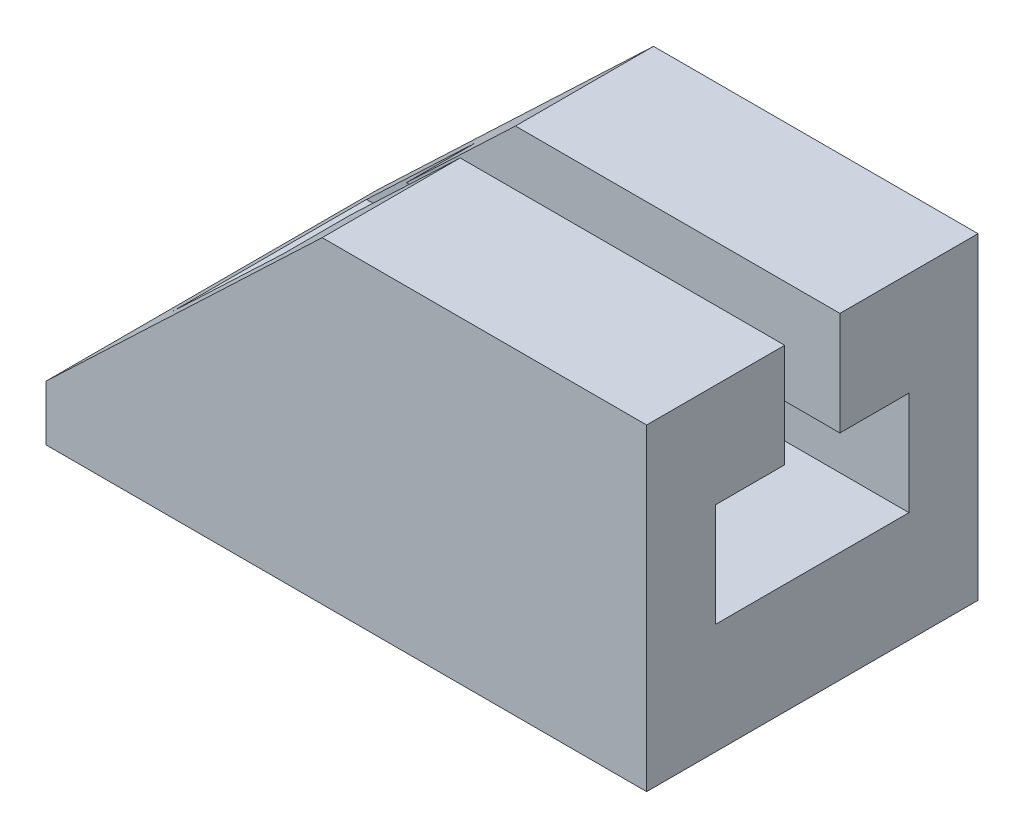
ISO-10303-21;
HEADER;
FILE_DESCRIPTION(('STEP AP214'),'2;1');
FILE_NAME('part.step','',(''),(''),'','','');
FILE_SCHEMA(('AUTOMOTIVE_DESIGN { 1 0 10303 214 1 1 1 1 }'));
ENDSEC;
DATA;
#1=APPLICATION_CONTEXT('core data for automotive mechanical design processes');
#2=APPLICATION_PROTOCOL_DEFINITION('international standard','automotive_design',2000,#1);
#3=PRODUCT_CONTEXT('',#1,'mechanical');
#4=PRODUCT('Part','Part','',(#3));
#5=PRODUCT_RELATED_PRODUCT_CATEGORY('part','',(#4));
#6=PRODUCT_DEFINITION_FORMATION('','',#4);
#7=PRODUCT_DEFINITION_CONTEXT('part definition',#1,'design');
#8=PRODUCT_DEFINITION('design','',#6,#7);
#9=PRODUCT_DEFINITION_SHAPE('','',#8);
#10=(LENGTH_UNIT() NAMED_UNIT(*) SI_UNIT(.MILLI.,.METRE.));
#11=(NAMED_UNIT(*) PLANE_ANGLE_UNIT() SI_UNIT($,.RADIAN.));
#12=(NAMED_UNIT(*) SI_UNIT($,.STERADIAN.) SOLID_ANGLE_UNIT());
#13=UNCERTAINTY_MEASURE_WITH_UNIT(LENGTH_MEASURE(1.E-05),#10,'distance_accuracy_value','');
#14=(GEOMETRIC_REPRESENTATION_CONTEXT(3) GLOBAL_UNCERTAINTY_ASSIGNED_CONTEXT((#13)) GLOBAL_UNIT_ASSIGNED_CONTEXT((#10,
#11,#12)) REPRESENTATION_CONTEXT('',''));
#15=CARTESIAN_POINT('',(0.,0.,0.));
#16=DIRECTION('',(0.,0.,1.));
#17=DIRECTION('',(1.,0.,0.));
#18=AXIS2_PLACEMENT_3D('',#15,#16,#17);
#19=CARTESIAN_POINT('',(0.,46.,0.));
#20=DIRECTION('',(0.,-1.,0.));
#21=DIRECTION('',(0.,0.,-1.));
#22=AXIS2_PLACEMENT_3D('',#19,#20,#21);
#23=PLANE('',#22);
#24=DIRECTION('',(-1.,0.,0.));
#25=VECTOR('',#24,1.);
#26=CARTESIAN_POINT('',(-43.5,46.,-24.));
#27=LINE('',#26,#25);
#28=CARTESIAN_POINT('',(43.5,46.,-24.));
#29=VERTEX_POINT('',#28);
#30=CARTESIAN_POINT('',(-3.5,46.,-24.));
#31=VERTEX_POINT('',#30);
#32=EDGE_CURVE('E119',#29,#31,#27,.T.);
#33=ORIENTED_EDGE('',*,*,#32,.T.);
#34=DIRECTION('',(0.,0.,1.));
#35=VECTOR('',#34,1.);
#36=CARTESIAN_POINT('',(-3.5,46.,-24.));
#37=LINE('',#36,#35);
#38=CARTESIAN_POINT('',(-3.5,46.,-4.));
#39=VERTEX_POINT('',#38);
#40=EDGE_CURVE('E138',#31,#39,#37,.T.);
#41=ORIENTED_EDGE('',*,*,#40,.T.);
#42=DIRECTION('',(1.,0.,0.));
#43=VECTOR('',#42,1.);
#44=CARTESIAN_POINT('',(-43.5,46.,-4.));
#45=LINE('',#44,#43);
#46=CARTESIAN_POINT('',(43.5,46.,-4.));
#47=VERTEX_POINT('',#46);
#48=EDGE_CURVE('E132',#39,#47,#45,.T.);
#49=ORIENTED_EDGE('',*,*,#48,.T.);
#50=DIRECTION('',(0.,0.,-1.));
#51=VECTOR('',#50,1.);
#52=CARTESIAN_POINT('',(43.5,46.,24.));
#53=LINE('',#52,#51);
#54=EDGE_CURVE('E86',#47,#29,#53,.T.);
#55=ORIENTED_EDGE('',*,*,#54,.T.);
#56=EDGE_LOOP('',(#33,#41,#49,#55));
#57=FACE_BOUND('',#56,.T.);
#58=ADVANCED_FACE('F33',(#57),#23,.F.);
#59=CARTESIAN_POINT('',(43.5,46.,24.));
#60=DIRECTION('',(-1.,0.,0.));
#61=DIRECTION('',(0.,0.,1.));
#62=AXIS2_PLACEMENT_3D('',#59,#60,#61);
#63=PLANE('',#62);
#64=ORIENTED_EDGE('',*,*,#54,.F.);
#65=DIRECTION('',(0.,1.,0.));
#66=VECTOR('',#65,1.);
#67=CARTESIAN_POINT('',(43.5,31.,-4.));
#68=LINE('',#67,#66);
#69=CARTESIAN_POINT('',(43.5,31.,-4.));
#70=VERTEX_POINT('',#69);
#71=EDGE_CURVE('E124',#70,#47,#68,.T.);
#72=ORIENTED_EDGE('',*,*,#71,.F.);
#73=DIRECTION('',(0.,0.,1.));
#74=VECTOR('',#73,1.);
#75=CARTESIAN_POINT('',(43.5,31.,-4.));
#76=LINE('',#75,#74);
#77=CARTESIAN_POINT('',(43.5,31.,-14.));
#78=VERTEX_POINT('',#77);
#79=EDGE_CURVE('E189',#78,#70,#76,.T.);
#80=ORIENTED_EDGE('',*,*,#79,.F.);
#81=DIRECTION('',(0.,1.,0.));
#82=VECTOR('',#81,1.);
#83=CARTESIAN_POINT('',(43.5,16.,-14.));
#84=LINE('',#83,#82);
#85=CARTESIAN_POINT('',(43.5,16.,-14.));
#86=VERTEX_POINT('',#85);
#87=EDGE_CURVE('E194',#86,#78,#84,.T.);
#88=ORIENTED_EDGE('',*,*,#87,.F.);
#89=DIRECTION('',(0.,0.,-1.));
#90=VECTOR('',#89,1.);
#91=CARTESIAN_POINT('',(43.5,16.,14.));
#92=LINE('',#91,#90);
#93=CARTESIAN_POINT('',(43.5,16.,14.));
#94=VERTEX_POINT('',#93);
#95=EDGE_CURVE('E197',#94,#86,#92,.T.);
#96=ORIENTED_EDGE('',*,*,#95,.F.);
#97=DIRECTION('',(0.,-1.,0.));
#98=VECTOR('',#97,1.);
#99=CARTESIAN_POINT('',(43.5,16.,14.));
#100=LINE('',#99,#98);
#101=CARTESIAN_POINT('',(43.5,31.,14.));
#102=VERTEX_POINT('',#101);
#103=EDGE_CURVE('E275',#102,#94,#100,.T.);
#104=ORIENTED_EDGE('',*,*,#103,.F.);
#105=DIRECTION('',(0.,0.,1.));
#106=VECTOR('',#105,1.);
#107=CARTESIAN_POINT('',(43.5,31.,14.));
#108=LINE('',#107,#106);
#109=CARTESIAN_POINT('',(43.5,31.,4.));
#110=VERTEX_POINT('',#109);
#111=EDGE_CURVE('E218',#110,#102,#108,.T.);
#112=ORIENTED_EDGE('',*,*,#111,.F.);
#113=DIRECTION('',(0.,-1.,0.));
#114=VECTOR('',#113,1.);
#115=CARTESIAN_POINT('',(43.5,31.,4.));
#116=LINE('',#115,#114);
#117=CARTESIAN_POINT('',(43.5,46.,4.));
#118=VERTEX_POINT('',#117);
#119=EDGE_CURVE('E214',#118,#110,#116,.T.);
#120=ORIENTED_EDGE('',*,*,#119,.F.);
#121=CARTESIAN_POINT('',(43.5,46.,24.));
#122=VERTEX_POINT('',#121);
#123=EDGE_CURVE('E95',#122,#118,#53,.T.);
#124=ORIENTED_EDGE('',*,*,#123,.F.);
#125=DIRECTION('',(0.,-1.,0.));
#126=VECTOR('',#125,1.);
#127=CARTESIAN_POINT('',(43.5,46.,24.));
#128=LINE('',#127,#126);
#129=CARTESIAN_POINT('',(43.5,0.,24.));
#130=VERTEX_POINT('',#129);
#131=EDGE_CURVE('E77',#122,#130,#128,.T.);
#132=ORIENTED_EDGE('',*,*,#131,.T.);
#133=DIRECTION('',(0.,0.,-1.));
#134=VECTOR('',#133,1.);
#135=CARTESIAN_POINT('',(43.5,0.,24.));
#136=LINE('',#135,#134);
#137=CARTESIAN_POINT('',(43.5,0.,-24.));
#138=VERTEX_POINT('',#137);
#139=EDGE_CURVE('E93',#130,#138,#136,.T.);
#140=ORIENTED_EDGE('',*,*,#139,.T.);
#141=DIRECTION('',(0.,-1.,0.));
#142=VECTOR('',#141,1.);
#143=CARTESIAN_POINT('',(43.5,46.,-24.));
#144=LINE('',#143,#142);
#145=EDGE_CURVE('E41',#29,#138,#144,.T.);
#146=ORIENTED_EDGE('',*,*,#145,.F.);
#147=EDGE_LOOP('',(#64,#72,#80,#88,#96,#104,#112,#120,#124,#132,#140,#146));
#148=FACE_BOUND('',#147,.T.);
#149=ADVANCED_FACE('F35',(#148),#63,.F.);
#150=CARTESIAN_POINT('',(-43.5,46.,-24.));
#151=DIRECTION('',(0.,0.,1.));
#152=DIRECTION('',(1.,0.,0.));
#153=AXIS2_PLACEMENT_3D('',#150,#151,#152);
#154=PLANE('',#153);
#155=DIRECTION('',(0.,-1.,0.));
#156=VECTOR('',#155,1.);
#157=CARTESIAN_POINT('',(-43.5,46.,-24.));
#158=LINE('',#157,#156);
#159=CARTESIAN_POINT('',(-43.5,8.,-24.));
#160=VERTEX_POINT('',#159);
#161=CARTESIAN_POINT('',(-43.5,0.,-24.));
#162=VERTEX_POINT('',#161);
#163=EDGE_CURVE('E112',#160,#162,#158,.T.);
#164=ORIENTED_EDGE('',*,*,#163,.F.);
#165=DIRECTION('',(0.724999433594414,0.688749461914693,0.));
#166=VECTOR('',#165,1.);
#167=CARTESIAN_POINT('',(-43.5,8.,-24.));
#168=LINE('',#167,#166);
#169=EDGE_CURVE('E252',#160,#31,#168,.T.);
#170=ORIENTED_EDGE('',*,*,#169,.T.);
#171=ORIENTED_EDGE('',*,*,#32,.F.);
#172=ORIENTED_EDGE('',*,*,#145,.T.);
#173=DIRECTION('',(-1.,0.,0.));
#174=VECTOR('',#173,1.);
#175=CARTESIAN_POINT('',(-43.5,0.,-24.));
#176=LINE('',#175,#174);
#177=EDGE_CURVE('E99',#138,#162,#176,.T.);
#178=ORIENTED_EDGE('',*,*,#177,.T.);
#179=EDGE_LOOP('',(#164,#170,#171,#172,#178));
#180=FACE_BOUND('',#179,.T.);
#181=ADVANCED_FACE('F116',(#180),#154,.F.);
#182=CARTESIAN_POINT('',(-43.5,46.,24.));
#183=DIRECTION('',(1.,0.,0.));
#184=DIRECTION('',(0.,0.,-1.));
#185=AXIS2_PLACEMENT_3D('',#182,#183,#184);
#186=PLANE('',#185);
#187=DIRECTION('',(0.,-1.,0.));
#188=VECTOR('',#187,1.);
#189=CARTESIAN_POINT('',(-43.5,46.,24.));
#190=LINE('',#189,#188);
#191=CARTESIAN_POINT('',(-43.5,8.,24.));
#192=VERTEX_POINT('',#191);
#193=CARTESIAN_POINT('',(-43.5,0.,24.));
#194=VERTEX_POINT('',#193);
#195=EDGE_CURVE('E81',#192,#194,#190,.T.);
#196=ORIENTED_EDGE('',*,*,#195,.F.);
#197=DIRECTION('',(0.,0.,1.));
#198=VECTOR('',#197,1.);
#199=CARTESIAN_POINT('',(-43.5,8.,-24.));
#200=LINE('',#199,#198);
#201=EDGE_CURVE('E248',#160,#192,#200,.T.);
#202=ORIENTED_EDGE('',*,*,#201,.F.);
#203=ORIENTED_EDGE('',*,*,#163,.T.);
#204=DIRECTION('',(0.,0.,1.));
#205=VECTOR('',#204,1.);
#206=CARTESIAN_POINT('',(-43.5,0.,24.));
#207=LINE('',#206,#205);
#208=EDGE_CURVE('E87',#162,#194,#207,.T.);
#209=ORIENTED_EDGE('',*,*,#208,.T.);
#210=EDGE_LOOP('',(#196,#202,#203,#209));
#211=FACE_BOUND('',#210,.T.);
#212=ADVANCED_FACE('F228',(#211),#186,.F.);
#213=CARTESIAN_POINT('',(-43.5,46.,24.));
#214=DIRECTION('',(0.,0.,-1.));
#215=DIRECTION('',(-1.,0.,0.));
#216=AXIS2_PLACEMENT_3D('',#213,#214,#215);
#217=PLANE('',#216);
#218=DIRECTION('',(1.,0.,0.));
#219=VECTOR('',#218,1.);
#220=CARTESIAN_POINT('',(-43.5,46.,24.));
#221=LINE('',#220,#219);
#222=CARTESIAN_POINT('',(-3.5,46.,24.));
#223=VERTEX_POINT('',#222);
#224=EDGE_CURVE('E55',#223,#122,#221,.T.);
#225=ORIENTED_EDGE('',*,*,#224,.F.);
#226=DIRECTION('',(0.724999433594414,0.688749461914693,0.));
#227=VECTOR('',#226,1.);
#228=CARTESIAN_POINT('',(-43.5,8.,24.));
#229=LINE('',#228,#227);
#230=EDGE_CURVE('E250',#192,#223,#229,.T.);
#231=ORIENTED_EDGE('',*,*,#230,.F.);
#232=ORIENTED_EDGE('',*,*,#195,.T.);
#233=DIRECTION('',(1.,0.,0.));
#234=VECTOR('',#233,1.);
#235=CARTESIAN_POINT('',(-43.5,0.,24.));
#236=LINE('',#235,#234);
#237=EDGE_CURVE('E74',#194,#130,#236,.T.);
#238=ORIENTED_EDGE('',*,*,#237,.T.);
#239=ORIENTED_EDGE('',*,*,#131,.F.);
#240=EDGE_LOOP('',(#225,#231,#232,#238,#239));
#241=FACE_BOUND('',#240,.T.);
#242=ADVANCED_FACE('F76',(#241),#217,.F.);
#243=DIRECTION('',(1.,0.,0.));
#244=VECTOR('',#243,1.);
#245=CARTESIAN_POINT('',(-43.5,46.,4.));
#246=LINE('',#245,#244);
#247=CARTESIAN_POINT('',(-3.5,46.,4.));
#248=VERTEX_POINT('',#247);
#249=EDGE_CURVE('E196',#248,#118,#246,.T.);
#250=ORIENTED_EDGE('',*,*,#249,.F.);
#251=EDGE_CURVE('E48',#248,#223,#37,.T.);
#252=ORIENTED_EDGE('',*,*,#251,.T.);
#253=ORIENTED_EDGE('',*,*,#224,.T.);
#254=ORIENTED_EDGE('',*,*,#123,.T.);
#255=EDGE_LOOP('',(#250,#252,#253,#254));
#256=FACE_BOUND('',#255,.T.);
#257=ADVANCED_FACE('F220',(#256),#23,.F.);
#258=CARTESIAN_POINT('',(0.,0.,0.));
#259=DIRECTION('',(0.,-1.,0.));
#260=DIRECTION('',(0.,0.,-1.));
#261=AXIS2_PLACEMENT_3D('',#258,#259,#260);
#262=PLANE('',#261);
#263=ORIENTED_EDGE('',*,*,#139,.F.);
#264=ORIENTED_EDGE('',*,*,#237,.F.);
#265=ORIENTED_EDGE('',*,*,#208,.F.);
#266=ORIENTED_EDGE('',*,*,#177,.F.);
#267=EDGE_LOOP('',(#263,#264,#265,#266));
#268=FACE_BOUND('',#267,.T.);
#269=ADVANCED_FACE('F97',(#268),#262,.T.);
#270=CARTESIAN_POINT('',(-43.5,31.,-4.));
#271=DIRECTION('',(0.,0.,-1.));
#272=DIRECTION('',(-1.,0.,0.));
#273=AXIS2_PLACEMENT_3D('',#270,#271,#272);
#274=PLANE('',#273);
#275=ORIENTED_EDGE('',*,*,#48,.F.);
#276=DIRECTION('',(-0.724999433594414,-0.688749461914693,0.));
#277=VECTOR('',#276,1.);
#278=CARTESIAN_POINT('',(-32.015111695138,18.9106438896189,-4.));
#279=LINE('',#278,#277);
#280=CARTESIAN_POINT('',(-19.2894736842105,31.,-4.));
#281=VERTEX_POINT('',#280);
#282=EDGE_CURVE('E186',#39,#281,#279,.T.);
#283=ORIENTED_EDGE('',*,*,#282,.T.);
#284=DIRECTION('',(1.,0.,0.));
#285=VECTOR('',#284,1.);
#286=CARTESIAN_POINT('',(-43.5,31.,-4.));
#287=LINE('',#286,#285);
#288=EDGE_CURVE('E101',#281,#70,#287,.T.);
#289=ORIENTED_EDGE('',*,*,#288,.T.);
#290=ORIENTED_EDGE('',*,*,#71,.T.);
#291=EDGE_LOOP('',(#275,#283,#289,#290));
#292=FACE_BOUND('',#291,.T.);
#293=ADVANCED_FACE('F185',(#292),#274,.F.);
#294=CARTESIAN_POINT('',(-43.5,31.,-4.));
#295=DIRECTION('',(0.,1.,0.));
#296=DIRECTION('',(0.,0.,1.));
#297=AXIS2_PLACEMENT_3D('',#294,#295,#296);
#298=PLANE('',#297);
#299=ORIENTED_EDGE('',*,*,#288,.F.);
#300=DIRECTION('',(0.,0.,-1.));
#301=VECTOR('',#300,1.);
#302=CARTESIAN_POINT('',(-19.2894736842105,31.,-4.));
#303=LINE('',#302,#301);
#304=CARTESIAN_POINT('',(-19.2894736842105,31.,-14.));
#305=VERTEX_POINT('',#304);
#306=EDGE_CURVE('E270',#281,#305,#303,.T.);
#307=ORIENTED_EDGE('',*,*,#306,.T.);
#308=DIRECTION('',(1.,0.,0.));
#309=VECTOR('',#308,1.);
#310=CARTESIAN_POINT('',(-43.5,31.,-14.));
#311=LINE('',#310,#309);
#312=EDGE_CURVE('E105',#305,#78,#311,.T.);
#313=ORIENTED_EDGE('',*,*,#312,.T.);
#314=ORIENTED_EDGE('',*,*,#79,.T.);
#315=EDGE_LOOP('',(#299,#307,#313,#314));
#316=FACE_BOUND('',#315,.T.);
#317=ADVANCED_FACE('F190',(#316),#298,.F.);
#318=CARTESIAN_POINT('',(-43.5,16.,-14.));
#319=DIRECTION('',(0.,0.,-1.));
#320=DIRECTION('',(-1.,0.,0.));
#321=AXIS2_PLACEMENT_3D('',#318,#319,#320);
#322=PLANE('',#321);
#323=ORIENTED_EDGE('',*,*,#312,.F.);
#324=DIRECTION('',(-0.724999433594414,-0.688749461914693,0.));
#325=VECTOR('',#324,1.);
#326=CARTESIAN_POINT('',(-39.5052562417871,11.7950065703022,-14.));
#327=LINE('',#326,#325);
#328=CARTESIAN_POINT('',(-35.078947368421,16.,-14.));
#329=VERTEX_POINT('',#328);
#330=EDGE_CURVE('E267',#305,#329,#327,.T.);
#331=ORIENTED_EDGE('',*,*,#330,.T.);
#332=DIRECTION('',(1.,0.,0.));
#333=VECTOR('',#332,1.);
#334=CARTESIAN_POINT('',(-43.5,16.,-14.));
#335=LINE('',#334,#333);
#336=EDGE_CURVE('E202',#329,#86,#335,.T.);
#337=ORIENTED_EDGE('',*,*,#336,.T.);
#338=ORIENTED_EDGE('',*,*,#87,.T.);
#339=EDGE_LOOP('',(#323,#331,#337,#338));
#340=FACE_BOUND('',#339,.T.);
#341=ADVANCED_FACE('F284',(#340),#322,.F.);
#342=CARTESIAN_POINT('',(-43.5,16.,14.));
#343=DIRECTION('',(0.,-1.,0.));
#344=DIRECTION('',(0.,0.,-1.));
#345=AXIS2_PLACEMENT_3D('',#342,#343,#344);
#346=PLANE('',#345);
#347=ORIENTED_EDGE('',*,*,#336,.F.);
#348=DIRECTION('',(0.,0.,1.));
#349=VECTOR('',#348,1.);
#350=CARTESIAN_POINT('',(-35.078947368421,16.,14.));
#351=LINE('',#350,#349);
#352=CARTESIAN_POINT('',(-35.078947368421,16.,14.));
#353=VERTEX_POINT('',#352);
#354=EDGE_CURVE('E264',#329,#353,#351,.T.);
#355=ORIENTED_EDGE('',*,*,#354,.T.);
#356=DIRECTION('',(1.,0.,0.));
#357=VECTOR('',#356,1.);
#358=CARTESIAN_POINT('',(-43.5,16.,14.));
#359=LINE('',#358,#357);
#360=EDGE_CURVE('E204',#353,#94,#359,.T.);
#361=ORIENTED_EDGE('',*,*,#360,.T.);
#362=ORIENTED_EDGE('',*,*,#95,.T.);
#363=EDGE_LOOP('',(#347,#355,#361,#362));
#364=FACE_BOUND('',#363,.T.);
#365=ADVANCED_FACE('F281',(#364),#346,.F.);
#366=CARTESIAN_POINT('',(-43.5,16.,14.));
#367=DIRECTION('',(0.,0.,1.));
#368=DIRECTION('',(1.,0.,0.));
#369=AXIS2_PLACEMENT_3D('',#366,#367,#368);
#370=PLANE('',#369);
#371=ORIENTED_EDGE('',*,*,#360,.F.);
#372=DIRECTION('',(0.724999433594414,0.688749461914693,0.));
#373=VECTOR('',#372,1.);
#374=CARTESIAN_POINT('',(-39.5052562417871,11.7950065703022,14.));
#375=LINE('',#374,#373);
#376=CARTESIAN_POINT('',(-19.2894736842105,31.,14.));
#377=VERTEX_POINT('',#376);
#378=EDGE_CURVE('E261',#353,#377,#375,.T.);
#379=ORIENTED_EDGE('',*,*,#378,.T.);
#380=DIRECTION('',(1.,0.,0.));
#381=VECTOR('',#380,1.);
#382=CARTESIAN_POINT('',(-43.5,31.,14.));
#383=LINE('',#382,#381);
#384=EDGE_CURVE('E206',#377,#102,#383,.T.);
#385=ORIENTED_EDGE('',*,*,#384,.T.);
#386=ORIENTED_EDGE('',*,*,#103,.T.);
#387=EDGE_LOOP('',(#371,#379,#385,#386));
#388=FACE_BOUND('',#387,.T.);
#389=ADVANCED_FACE('F286',(#388),#370,.F.);
#390=CARTESIAN_POINT('',(-43.5,31.,14.));
#391=DIRECTION('',(0.,1.,0.));
#392=DIRECTION('',(0.,0.,1.));
#393=AXIS2_PLACEMENT_3D('',#390,#391,#392);
#394=PLANE('',#393);
#395=ORIENTED_EDGE('',*,*,#384,.F.);
#396=DIRECTION('',(0.,0.,-1.));
#397=VECTOR('',#396,1.);
#398=CARTESIAN_POINT('',(-19.2894736842105,31.,14.));
#399=LINE('',#398,#397);
#400=CARTESIAN_POINT('',(-19.2894736842105,31.,4.));
#401=VERTEX_POINT('',#400);
#402=EDGE_CURVE('E255',#377,#401,#399,.T.);
#403=ORIENTED_EDGE('',*,*,#402,.T.);
#404=DIRECTION('',(1.,0.,0.));
#405=VECTOR('',#404,1.);
#406=CARTESIAN_POINT('',(-43.5,31.,4.));
#407=LINE('',#406,#405);
#408=EDGE_CURVE('E208',#401,#110,#407,.T.);
#409=ORIENTED_EDGE('',*,*,#408,.T.);
#410=ORIENTED_EDGE('',*,*,#111,.T.);
#411=EDGE_LOOP('',(#395,#403,#409,#410));
#412=FACE_BOUND('',#411,.T.);
#413=ADVANCED_FACE('F289',(#412),#394,.F.);
#414=CARTESIAN_POINT('',(-43.5,31.,4.));
#415=DIRECTION('',(0.,0.,1.));
#416=DIRECTION('',(1.,0.,0.));
#417=AXIS2_PLACEMENT_3D('',#414,#415,#416);
#418=PLANE('',#417);
#419=ORIENTED_EDGE('',*,*,#408,.F.);
#420=DIRECTION('',(0.724999433594414,0.688749461914693,0.));
#421=VECTOR('',#420,1.);
#422=CARTESIAN_POINT('',(-32.015111695138,18.9106438896189,4.));
#423=LINE('',#422,#421);
#424=EDGE_CURVE('E11',#401,#248,#423,.T.);
#425=ORIENTED_EDGE('',*,*,#424,.T.);
#426=ORIENTED_EDGE('',*,*,#249,.T.);
#427=ORIENTED_EDGE('',*,*,#119,.T.);
#428=EDGE_LOOP('',(#419,#425,#426,#427));
#429=FACE_BOUND('',#428,.T.);
#430=ADVANCED_FACE('F213',(#429),#418,.F.);
#431=CARTESIAN_POINT('',(-43.5,8.,-24.));
#432=DIRECTION('',(0.688749461914693,-0.724999433594414,0.));
#433=DIRECTION('',(0.724999433594414,0.688749461914693,0.));
#434=AXIS2_PLACEMENT_3D('',#431,#432,#433);
#435=PLANE('',#434);
#436=ORIENTED_EDGE('',*,*,#40,.F.);
#437=ORIENTED_EDGE('',*,*,#169,.F.);
#438=ORIENTED_EDGE('',*,*,#201,.T.);
#439=ORIENTED_EDGE('',*,*,#230,.T.);
#440=ORIENTED_EDGE('',*,*,#251,.F.);
#441=ORIENTED_EDGE('',*,*,#424,.F.);
#442=ORIENTED_EDGE('',*,*,#402,.F.);
#443=ORIENTED_EDGE('',*,*,#378,.F.);
#444=ORIENTED_EDGE('',*,*,#354,.F.);
#445=ORIENTED_EDGE('',*,*,#330,.F.);
#446=ORIENTED_EDGE('',*,*,#306,.F.);
#447=ORIENTED_EDGE('',*,*,#282,.F.);
#448=EDGE_LOOP('',(#436,#437,#438,#439,#440,#441,#442,#443,#444,#445,#446,#447));
#449=FACE_BOUND('',#448,.T.);
#450=ADVANCED_FACE('F251',(#449),#435,.F.);
#451=CLOSED_SHELL('',(#58,#149,#181,#212,#242,#257,#269,#293,#317,#341,#365,#389,#413,#430,#450));
#452=MANIFOLD_SOLID_BREP('B2',#451);
#453=ADVANCED_BREP_SHAPE_REPRESENTATION('',(#18,#452),#14);
#454=SHAPE_DEFINITION_REPRESENTATION(#9,#453);
ENDSEC;
END-ISO-10303-21;
